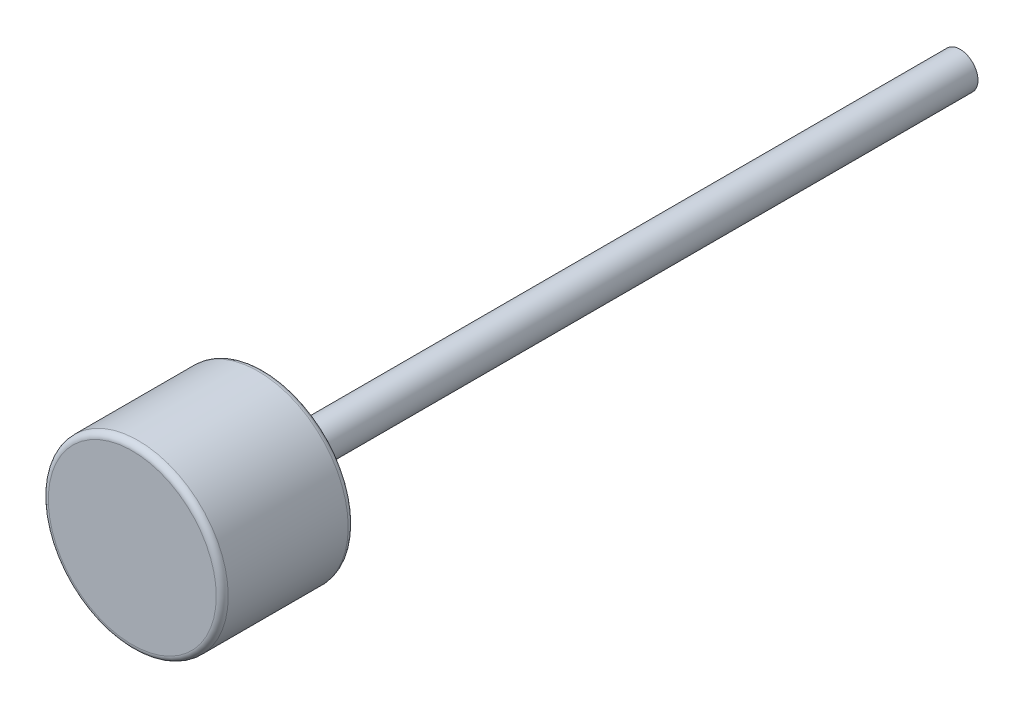
ISO-10303-21;
HEADER;
FILE_DESCRIPTION(('STEP AP214'),'2;1');
FILE_NAME('part.step','',(''),(''),'','','');
FILE_SCHEMA(('AUTOMOTIVE_DESIGN { 1 0 10303 214 1 1 1 1 }'));
ENDSEC;
DATA;
#1=APPLICATION_CONTEXT('core data for automotive mechanical design processes');
#2=APPLICATION_PROTOCOL_DEFINITION('international standard','automotive_design',2000,#1);
#3=PRODUCT_CONTEXT('',#1,'mechanical');
#4=PRODUCT('Part','Part','',(#3));
#5=PRODUCT_RELATED_PRODUCT_CATEGORY('part','',(#4));
#6=PRODUCT_DEFINITION_FORMATION('','',#4);
#7=PRODUCT_DEFINITION_CONTEXT('part definition',#1,'design');
#8=PRODUCT_DEFINITION('design','',#6,#7);
#9=PRODUCT_DEFINITION_SHAPE('','',#8);
#10=(LENGTH_UNIT() NAMED_UNIT(*) SI_UNIT(.MILLI.,.METRE.));
#11=(NAMED_UNIT(*) PLANE_ANGLE_UNIT() SI_UNIT($,.RADIAN.));
#12=(NAMED_UNIT(*) SI_UNIT($,.STERADIAN.) SOLID_ANGLE_UNIT());
#13=UNCERTAINTY_MEASURE_WITH_UNIT(LENGTH_MEASURE(1.E-05),#10,'distance_accuracy_value','');
#14=(GEOMETRIC_REPRESENTATION_CONTEXT(3) GLOBAL_UNCERTAINTY_ASSIGNED_CONTEXT((#13)) GLOBAL_UNIT_ASSIGNED_CONTEXT((#10,
#11,#12)) REPRESENTATION_CONTEXT('',''));
#15=CARTESIAN_POINT('',(0.,0.,0.));
#16=DIRECTION('',(0.,0.,1.));
#17=DIRECTION('',(1.,0.,0.));
#18=AXIS2_PLACEMENT_3D('',#15,#16,#17);
#19=CARTESIAN_POINT('',(0.,0.,11.));
#20=DIRECTION('',(0.,0.,-1.));
#21=DIRECTION('',(-1.,0.,0.));
#22=AXIS2_PLACEMENT_3D('',#19,#20,#21);
#23=CYLINDRICAL_SURFACE('',#22,7.5);
#24=CARTESIAN_POINT('',(0.,0.,0.5));
#25=DIRECTION('',(0.,0.,1.));
#26=DIRECTION('',(1.,0.,0.));
#27=AXIS2_PLACEMENT_3D('',#24,#25,#26);
#28=CIRCLE('',#27,7.5);
#29=CARTESIAN_POINT('',(7.5,0.,0.5));
#30=VERTEX_POINT('',#29);
#31=EDGE_CURVE('E51',#30,#30,#28,.T.);
#32=ORIENTED_EDGE('',*,*,#31,.T.);
#33=EDGE_LOOP('',(#32));
#34=FACE_BOUND('',#33,.T.);
#35=CARTESIAN_POINT('',(0.,0.,10.5));
#36=DIRECTION('',(0.,0.,1.));
#37=DIRECTION('',(1.,0.,0.));
#38=AXIS2_PLACEMENT_3D('',#35,#36,#37);
#39=CIRCLE('',#38,7.5);
#40=CARTESIAN_POINT('',(7.5,0.,10.5));
#41=VERTEX_POINT('',#40);
#42=EDGE_CURVE('E56',#41,#41,#39,.F.);
#43=ORIENTED_EDGE('',*,*,#42,.T.);
#44=EDGE_LOOP('',(#43));
#45=FACE_BOUND('',#44,.T.);
#46=ADVANCED_FACE('F36',(#34,#45),#23,.T.);
#47=CARTESIAN_POINT('',(0.,0.,11.));
#48=DIRECTION('',(0.,0.,1.));
#49=DIRECTION('',(1.,0.,0.));
#50=AXIS2_PLACEMENT_3D('',#47,#48,#49);
#51=PLANE('',#50);
#52=CARTESIAN_POINT('',(0.,0.,11.));
#53=DIRECTION('',(0.,0.,1.));
#54=DIRECTION('',(1.,0.,0.));
#55=AXIS2_PLACEMENT_3D('',#52,#53,#54);
#56=CIRCLE('',#55,7.);
#57=CARTESIAN_POINT('',(7.,0.,11.));
#58=VERTEX_POINT('',#57);
#59=EDGE_CURVE('E43',#58,#58,#56,.T.);
#60=ORIENTED_EDGE('',*,*,#59,.T.);
#61=EDGE_LOOP('',(#60));
#62=FACE_BOUND('',#61,.T.);
#63=ADVANCED_FACE('F77',(#62),#51,.T.);
#64=CARTESIAN_POINT('',(0.,0.,0.));
#65=DIRECTION('',(0.,0.,1.));
#66=DIRECTION('',(1.,0.,0.));
#67=AXIS2_PLACEMENT_3D('',#64,#65,#66);
#68=PLANE('',#67);
#69=CARTESIAN_POINT('',(0.,0.,0.));
#70=DIRECTION('',(0.,0.,1.));
#71=DIRECTION('',(1.,0.,0.));
#72=AXIS2_PLACEMENT_3D('',#69,#70,#71);
#73=CIRCLE('',#72,1.5);
#74=CARTESIAN_POINT('',(1.5,0.,0.));
#75=VERTEX_POINT('',#74);
#76=EDGE_CURVE('E10',#75,#75,#73,.F.);
#77=ORIENTED_EDGE('',*,*,#76,.F.);
#78=EDGE_LOOP('',(#77));
#79=FACE_BOUND('',#78,.T.);
#80=CARTESIAN_POINT('',(0.,0.,0.));
#81=DIRECTION('',(0.,0.,1.));
#82=DIRECTION('',(1.,0.,0.));
#83=AXIS2_PLACEMENT_3D('',#80,#81,#82);
#84=CIRCLE('',#83,7.);
#85=CARTESIAN_POINT('',(7.,0.,0.));
#86=VERTEX_POINT('',#85);
#87=EDGE_CURVE('E47',#86,#86,#84,.F.);
#88=ORIENTED_EDGE('',*,*,#87,.T.);
#89=EDGE_LOOP('',(#88));
#90=FACE_BOUND('',#89,.T.);
#91=ADVANCED_FACE('F83',(#79,#90),#68,.F.);
#92=CARTESIAN_POINT('',(0.,0.,0.5));
#93=DIRECTION('',(0.,0.,1.));
#94=DIRECTION('',(1.,0.,0.));
#95=AXIS2_PLACEMENT_3D('',#92,#93,#94);
#96=TOROIDAL_SURFACE('',#95,7.,0.5);
#97=ORIENTED_EDGE('',*,*,#87,.F.);
#98=EDGE_LOOP('',(#97));
#99=FACE_BOUND('',#98,.T.);
#100=ORIENTED_EDGE('',*,*,#31,.F.);
#101=EDGE_LOOP('',(#100));
#102=FACE_BOUND('',#101,.T.);
#103=ADVANCED_FACE('F73',(#99,#102),#96,.T.);
#104=CARTESIAN_POINT('',(0.,0.,10.5));
#105=DIRECTION('',(0.,0.,1.));
#106=DIRECTION('',(1.,0.,0.));
#107=AXIS2_PLACEMENT_3D('',#104,#105,#106);
#108=TOROIDAL_SURFACE('',#107,7.,0.5);
#109=ORIENTED_EDGE('',*,*,#42,.F.);
#110=EDGE_LOOP('',(#109));
#111=FACE_BOUND('',#110,.T.);
#112=ORIENTED_EDGE('',*,*,#59,.F.);
#113=EDGE_LOOP('',(#112));
#114=FACE_BOUND('',#113,.T.);
#115=ADVANCED_FACE('F38',(#111,#114),#108,.T.);
#116=CARTESIAN_POINT('',(0.,0.,-58.));
#117=DIRECTION('',(0.,0.,1.));
#118=DIRECTION('',(1.,0.,0.));
#119=AXIS2_PLACEMENT_3D('',#116,#117,#118);
#120=CYLINDRICAL_SURFACE('',#119,1.5);
#121=CARTESIAN_POINT('',(0.,0.,-58.));
#122=DIRECTION('',(0.,0.,-1.));
#123=DIRECTION('',(-1.,0.,0.));
#124=AXIS2_PLACEMENT_3D('',#121,#122,#123);
#125=CIRCLE('',#124,1.5);
#126=CARTESIAN_POINT('',(1.5,0.,-58.));
#127=VERTEX_POINT('',#126);
#128=EDGE_CURVE('E59',#127,#127,#125,.T.);
#129=CARTESIAN_POINT('',(1.5,0.,-58.));
#130=CARTESIAN_POINT('',(1.5,0.,-57.3958333333333));
#131=CARTESIAN_POINT('',(1.5,0.,-56.7916666666667));
#132=CARTESIAN_POINT('',(1.5,0.,-55.5833333333333));
#133=CARTESIAN_POINT('',(1.5,0.,-54.9791666666667));
#134=CARTESIAN_POINT('',(1.5,0.,-53.7708333333333));
#135=CARTESIAN_POINT('',(1.5,0.,-53.1666666666667));
#136=CARTESIAN_POINT('',(1.5,0.,-51.9583333333333));
#137=CARTESIAN_POINT('',(1.5,0.,-51.3541666666667));
#138=CARTESIAN_POINT('',(1.5,0.,-50.1458333333333));
#139=CARTESIAN_POINT('',(1.5,0.,-49.5416666666667));
#140=CARTESIAN_POINT('',(1.5,0.,-48.3333333333333));
#141=CARTESIAN_POINT('',(1.5,0.,-47.7291666666667));
#142=CARTESIAN_POINT('',(1.5,0.,-46.5208333333333));
#143=CARTESIAN_POINT('',(1.5,0.,-45.9166666666667));
#144=CARTESIAN_POINT('',(1.5,0.,-44.7083333333333));
#145=CARTESIAN_POINT('',(1.5,0.,-44.1041666666667));
#146=CARTESIAN_POINT('',(1.5,0.,-42.8958333333333));
#147=CARTESIAN_POINT('',(1.5,0.,-42.2916666666667));
#148=CARTESIAN_POINT('',(1.5,0.,-41.0833333333333));
#149=CARTESIAN_POINT('',(1.5,0.,-40.4791666666667));
#150=CARTESIAN_POINT('',(1.5,0.,-39.2708333333333));
#151=CARTESIAN_POINT('',(1.5,0.,-38.6666666666667));
#152=CARTESIAN_POINT('',(1.5,0.,-37.4583333333333));
#153=CARTESIAN_POINT('',(1.5,0.,-36.8541666666667));
#154=CARTESIAN_POINT('',(1.5,0.,-35.6458333333333));
#155=CARTESIAN_POINT('',(1.5,0.,-35.0416666666667));
#156=CARTESIAN_POINT('',(1.5,0.,-33.8333333333333));
#157=CARTESIAN_POINT('',(1.5,0.,-33.2291666666667));
#158=CARTESIAN_POINT('',(1.5,0.,-32.0208333333333));
#159=CARTESIAN_POINT('',(1.5,0.,-31.4166666666667));
#160=CARTESIAN_POINT('',(1.5,0.,-30.2083333333333));
#161=CARTESIAN_POINT('',(1.5,0.,-29.6041666666667));
#162=CARTESIAN_POINT('',(1.5,0.,-28.3958333333333));
#163=CARTESIAN_POINT('',(1.5,0.,-27.7916666666667));
#164=CARTESIAN_POINT('',(1.5,0.,-26.5833333333333));
#165=CARTESIAN_POINT('',(1.5,0.,-25.9791666666667));
#166=CARTESIAN_POINT('',(1.5,0.,-24.7708333333333));
#167=CARTESIAN_POINT('',(1.5,0.,-24.1666666666667));
#168=CARTESIAN_POINT('',(1.5,0.,-22.9583333333333));
#169=CARTESIAN_POINT('',(1.5,0.,-22.3541666666667));
#170=CARTESIAN_POINT('',(1.5,0.,-21.1458333333333));
#171=CARTESIAN_POINT('',(1.5,0.,-20.5416666666667));
#172=CARTESIAN_POINT('',(1.5,0.,-19.3333333333333));
#173=CARTESIAN_POINT('',(1.5,0.,-18.7291666666667));
#174=CARTESIAN_POINT('',(1.5,0.,-17.5208333333333));
#175=CARTESIAN_POINT('',(1.5,0.,-16.9166666666667));
#176=CARTESIAN_POINT('',(1.5,0.,-15.7083333333333));
#177=CARTESIAN_POINT('',(1.5,0.,-15.1041666666667));
#178=CARTESIAN_POINT('',(1.5,0.,-13.8958333333333));
#179=CARTESIAN_POINT('',(1.5,0.,-13.2916666666667));
#180=CARTESIAN_POINT('',(1.5,0.,-12.0833333333333));
#181=CARTESIAN_POINT('',(1.5,0.,-11.4791666666667));
#182=CARTESIAN_POINT('',(1.5,0.,-10.2708333333333));
#183=CARTESIAN_POINT('',(1.5,0.,-9.66666666666667));
#184=CARTESIAN_POINT('',(1.5,0.,-8.45833333333333));
#185=CARTESIAN_POINT('',(1.5,0.,-7.85416666666667));
#186=CARTESIAN_POINT('',(1.5,0.,-6.64583333333333));
#187=CARTESIAN_POINT('',(1.5,0.,-6.04166666666667));
#188=CARTESIAN_POINT('',(1.5,0.,-4.83333333333333));
#189=CARTESIAN_POINT('',(1.5,0.,-4.22916666666667));
#190=CARTESIAN_POINT('',(1.5,0.,-3.02083333333334));
#191=CARTESIAN_POINT('',(1.5,0.,-2.41666666666667));
#192=CARTESIAN_POINT('',(1.5,0.,-1.20833333333333));
#193=CARTESIAN_POINT('',(1.5,0.,-0.604166666666666));
#194=CARTESIAN_POINT('',(1.5,0.,0.));
#195=B_SPLINE_CURVE_WITH_KNOTS('',3,(#129,#130,#131,#132,#133,#134,#135,#136,#137,#138,#139,
#140,#141,#142,#143,#144,#145,#146,#147,#148,#149,#150,#151,#152,#153,#154,#155,#156,#157,#158,
#159,#160,#161,#162,#163,#164,#165,#166,#167,#168,#169,#170,#171,#172,#173,#174,#175,#176,#177,
#178,#179,#180,#181,#182,#183,#184,#185,#186,#187,#188,#189,#190,#191,#192,#193,#194),
.UNSPECIFIED.,.F.,.F.,(4,2,2,2,2,2,2,2,2,2,2,2,2,2,2,2,2,2,2,2,2,2,2,2,2,2,2,2,2,2,2,2,4),(0.,
1.81249999999999,3.625,5.4375,7.24999999999999,9.06249999999999,10.875,12.6875,14.5,16.3125,
18.125,19.9375,21.75,23.5625,25.375,27.1875,29.,30.8125,32.625,34.4375,36.25,38.0625,39.875,
41.6875,43.5,45.3125,47.125,48.9375,50.75,52.5625,54.375,56.1875,58.),.UNSPECIFIED.);
#196=EDGE_CURVE('BSEAM65',#127,#75,#195,.T.);
#197=ORIENTED_EDGE('',*,*,#128,.F.);
#198=ORIENTED_EDGE('',*,*,#76,.T.);
#199=ORIENTED_EDGE('',*,*,#196,.T.);
#200=ORIENTED_EDGE('',*,*,#196,.F.);
#201=EDGE_LOOP('',(#197,#199,#198,#200));
#202=FACE_BOUND('',#201,.T.);
#203=ADVANCED_FACE('F65',(#202),#120,.T.);
#204=CARTESIAN_POINT('',(0.,0.,-58.));
#205=DIRECTION('',(0.,0.,-1.));
#206=DIRECTION('',(-1.,0.,0.));
#207=AXIS2_PLACEMENT_3D('',#204,#205,#206);
#208=PLANE('',#207);
#209=ORIENTED_EDGE('',*,*,#128,.T.);
#210=EDGE_LOOP('',(#209));
#211=FACE_BOUND('',#210,.T.);
#212=ADVANCED_FACE('F63',(#211),#208,.T.);
#213=CLOSED_SHELL('',(#46,#63,#91,#103,#115,#203,#212));
#214=MANIFOLD_SOLID_BREP('B2',#213);
#215=ADVANCED_BREP_SHAPE_REPRESENTATION('',(#18,#214),#14);
#216=SHAPE_DEFINITION_REPRESENTATION(#9,#215);
ENDSEC;
END-ISO-10303-21;
